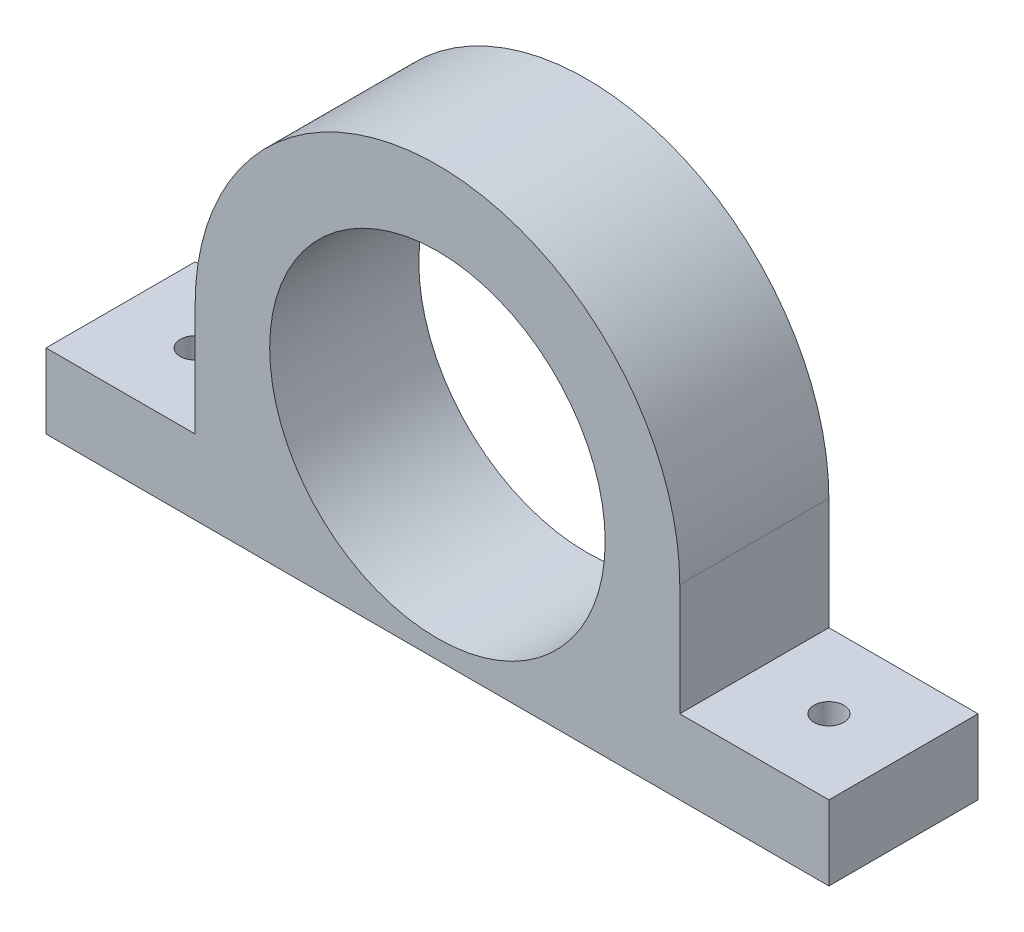
ISO-10303-21;
HEADER;
FILE_DESCRIPTION(('STEP AP214'),'2;1');
FILE_NAME('part.step','',(''),(''),'','','');
FILE_SCHEMA(('AUTOMOTIVE_DESIGN { 1 0 10303 214 1 1 1 1 }'));
ENDSEC;
DATA;
#1=APPLICATION_CONTEXT('core data for automotive mechanical design processes');
#2=APPLICATION_PROTOCOL_DEFINITION('international standard','automotive_design',2000,#1);
#3=PRODUCT_CONTEXT('',#1,'mechanical');
#4=PRODUCT('Part','Part','',(#3));
#5=PRODUCT_RELATED_PRODUCT_CATEGORY('part','',(#4));
#6=PRODUCT_DEFINITION_FORMATION('','',#4);
#7=PRODUCT_DEFINITION_CONTEXT('part definition',#1,'design');
#8=PRODUCT_DEFINITION('design','',#6,#7);
#9=PRODUCT_DEFINITION_SHAPE('','',#8);
#10=(LENGTH_UNIT() NAMED_UNIT(*) SI_UNIT(.MILLI.,.METRE.));
#11=(NAMED_UNIT(*) PLANE_ANGLE_UNIT() SI_UNIT($,.RADIAN.));
#12=(NAMED_UNIT(*) SI_UNIT($,.STERADIAN.) SOLID_ANGLE_UNIT());
#13=UNCERTAINTY_MEASURE_WITH_UNIT(LENGTH_MEASURE(1.E-05),#10,'distance_accuracy_value','');
#14=(GEOMETRIC_REPRESENTATION_CONTEXT(3) GLOBAL_UNCERTAINTY_ASSIGNED_CONTEXT((#13)) GLOBAL_UNIT_ASSIGNED_CONTEXT((#10,
#11,#12)) REPRESENTATION_CONTEXT('',''));
#15=CARTESIAN_POINT('',(0.,0.,0.));
#16=DIRECTION('',(0.,0.,1.));
#17=DIRECTION('',(1.,0.,0.));
#18=AXIS2_PLACEMENT_3D('',#15,#16,#17);
#19=CARTESIAN_POINT('',(-52.5,-25.,-187.499999999998));
#20=DIRECTION('',(0.,-1.,0.));
#21=DIRECTION('',(0.,0.,-1.));
#22=AXIS2_PLACEMENT_3D('',#19,#20,#21);
#23=PLANE('',#22);
#24=CARTESIAN_POINT('',(42.5,-25.,-177.499999999998));
#25=DIRECTION('',(0.,1.,0.));
#26=DIRECTION('',(0.,0.,1.));
#27=AXIS2_PLACEMENT_3D('',#24,#25,#26);
#28=CIRCLE('',#27,1.99999999999999);
#29=CARTESIAN_POINT('',(42.5,-25.,-175.499999999998));
#30=VERTEX_POINT('',#29);
#31=EDGE_CURVE('E217',#30,#30,#28,.T.);
#32=ORIENTED_EDGE('',*,*,#31,.T.);
#33=EDGE_LOOP('',(#32));
#34=FACE_BOUND('',#33,.T.);
#35=DIRECTION('',(1.,0.,0.));
#36=VECTOR('',#35,1.);
#37=CARTESIAN_POINT('',(-52.5,-25.,-167.499999999998));
#38=LINE('',#37,#36);
#39=CARTESIAN_POINT('',(-52.5,-25.,-167.499999999998));
#40=VERTEX_POINT('',#39);
#41=CARTESIAN_POINT('',(52.5,-25.,-167.499999999998));
#42=VERTEX_POINT('',#41);
#43=EDGE_CURVE('E144',#40,#42,#38,.T.);
#44=ORIENTED_EDGE('',*,*,#43,.F.);
#45=DIRECTION('',(0.,0.,1.));
#46=VECTOR('',#45,1.);
#47=CARTESIAN_POINT('',(-52.5,-25.,-187.499999999998));
#48=LINE('',#47,#46);
#49=CARTESIAN_POINT('',(-52.5,-25.,-187.499999999998));
#50=VERTEX_POINT('',#49);
#51=EDGE_CURVE('E156',#50,#40,#48,.T.);
#52=ORIENTED_EDGE('',*,*,#51,.F.);
#53=DIRECTION('',(1.,0.,0.));
#54=VECTOR('',#53,1.);
#55=CARTESIAN_POINT('',(-52.5,-25.,-187.499999999998));
#56=LINE('',#55,#54);
#57=CARTESIAN_POINT('',(52.5,-25.,-187.499999999998));
#58=VERTEX_POINT('',#57);
#59=EDGE_CURVE('E124',#50,#58,#56,.T.);
#60=ORIENTED_EDGE('',*,*,#59,.T.);
#61=DIRECTION('',(0.,0.,1.));
#62=VECTOR('',#61,1.);
#63=CARTESIAN_POINT('',(52.5,-25.,-187.499999999998));
#64=LINE('',#63,#62);
#65=EDGE_CURVE('E113',#58,#42,#64,.T.);
#66=ORIENTED_EDGE('',*,*,#65,.T.);
#67=EDGE_LOOP('',(#44,#52,#60,#66));
#68=FACE_BOUND('',#67,.T.);
#69=CARTESIAN_POINT('',(-42.5,-24.9999999999998,-177.499999999998));
#70=DIRECTION('',(0.,1.,0.));
#71=DIRECTION('',(0.,0.,1.));
#72=AXIS2_PLACEMENT_3D('',#69,#70,#71);
#73=CIRCLE('',#72,1.99999999999999);
#74=CARTESIAN_POINT('',(-42.5,-24.9999999999998,-175.499999999998));
#75=VERTEX_POINT('',#74);
#76=EDGE_CURVE('E227',#75,#75,#73,.T.);
#77=ORIENTED_EDGE('',*,*,#76,.T.);
#78=EDGE_LOOP('',(#77));
#79=FACE_BOUND('',#78,.T.);
#80=ADVANCED_FACE('F33',(#34,#68,#79),#23,.T.);
#81=CARTESIAN_POINT('',(0.,0.,-187.499999999998));
#82=DIRECTION('',(0.,0.,1.));
#83=DIRECTION('',(1.,0.,0.));
#84=AXIS2_PLACEMENT_3D('',#81,#82,#83);
#85=CYLINDRICAL_SURFACE('',#84,32.5);
#86=CARTESIAN_POINT('',(0.,0.,-167.499999999998));
#87=DIRECTION('',(0.,0.,1.));
#88=DIRECTION('',(-1.,0.,0.));
#89=AXIS2_PLACEMENT_3D('',#86,#87,#88);
#90=CIRCLE('',#89,32.5);
#91=CARTESIAN_POINT('',(32.5,0.,-167.499999999998));
#92=VERTEX_POINT('',#91);
#93=CARTESIAN_POINT('',(-32.5,0.,-167.499999999998));
#94=VERTEX_POINT('',#93);
#95=EDGE_CURVE('E131',#92,#94,#90,.T.);
#96=ORIENTED_EDGE('',*,*,#95,.F.);
#97=DIRECTION('',(0.,0.,1.));
#98=VECTOR('',#97,1.);
#99=CARTESIAN_POINT('',(32.5,0.,-187.499999999998));
#100=LINE('',#99,#98);
#101=CARTESIAN_POINT('',(32.5,0.,-187.499999999998));
#102=VERTEX_POINT('',#101);
#103=EDGE_CURVE('E11',#102,#92,#100,.T.);
#104=ORIENTED_EDGE('',*,*,#103,.F.);
#105=CARTESIAN_POINT('',(0.,0.,-187.499999999998));
#106=DIRECTION('',(0.,0.,1.));
#107=DIRECTION('',(-1.,0.,0.));
#108=AXIS2_PLACEMENT_3D('',#105,#106,#107);
#109=CIRCLE('',#108,32.5);
#110=CARTESIAN_POINT('',(-32.5,0.,-187.499999999998));
#111=VERTEX_POINT('',#110);
#112=EDGE_CURVE('E152',#102,#111,#109,.T.);
#113=ORIENTED_EDGE('',*,*,#112,.T.);
#114=DIRECTION('',(0.,0.,1.));
#115=VECTOR('',#114,1.);
#116=CARTESIAN_POINT('',(-32.5,0.,-187.499999999998));
#117=LINE('',#116,#115);
#118=EDGE_CURVE('E37',#111,#94,#117,.T.);
#119=ORIENTED_EDGE('',*,*,#118,.T.);
#120=EDGE_LOOP('',(#96,#104,#113,#119));
#121=FACE_BOUND('',#120,.T.);
#122=ADVANCED_FACE('F35',(#121),#85,.T.);
#123=CARTESIAN_POINT('',(32.5,-15.,-187.499999999998));
#124=DIRECTION('',(1.,0.,0.));
#125=DIRECTION('',(0.,0.,-1.));
#126=AXIS2_PLACEMENT_3D('',#123,#124,#125);
#127=PLANE('',#126);
#128=DIRECTION('',(0.,1.,0.));
#129=VECTOR('',#128,1.);
#130=CARTESIAN_POINT('',(32.5,-15.,-167.499999999998));
#131=LINE('',#130,#129);
#132=CARTESIAN_POINT('',(32.5,-15.,-167.499999999998));
#133=VERTEX_POINT('',#132);
#134=EDGE_CURVE('E150',#133,#92,#131,.T.);
#135=ORIENTED_EDGE('',*,*,#134,.F.);
#136=DIRECTION('',(0.,0.,1.));
#137=VECTOR('',#136,1.);
#138=CARTESIAN_POINT('',(32.5,-15.,-187.499999999998));
#139=LINE('',#138,#137);
#140=CARTESIAN_POINT('',(32.5,-15.,-187.499999999998));
#141=VERTEX_POINT('',#140);
#142=EDGE_CURVE('E43',#141,#133,#139,.T.);
#143=ORIENTED_EDGE('',*,*,#142,.F.);
#144=DIRECTION('',(0.,1.,0.));
#145=VECTOR('',#144,1.);
#146=CARTESIAN_POINT('',(32.5,-15.,-187.499999999998));
#147=LINE('',#146,#145);
#148=EDGE_CURVE('E121',#141,#102,#147,.T.);
#149=ORIENTED_EDGE('',*,*,#148,.T.);
#150=ORIENTED_EDGE('',*,*,#103,.T.);
#151=EDGE_LOOP('',(#135,#143,#149,#150));
#152=FACE_BOUND('',#151,.T.);
#153=ADVANCED_FACE('F164',(#152),#127,.T.);
#154=CARTESIAN_POINT('',(52.5,-15.,-187.499999999998));
#155=DIRECTION('',(0.,1.,0.));
#156=DIRECTION('',(-1.,0.,0.));
#157=AXIS2_PLACEMENT_3D('',#154,#155,#156);
#158=PLANE('',#157);
#159=CARTESIAN_POINT('',(42.5,-15.,-177.499999999998));
#160=DIRECTION('',(0.,1.,0.));
#161=DIRECTION('',(0.,0.,1.));
#162=AXIS2_PLACEMENT_3D('',#159,#160,#161);
#163=CIRCLE('',#162,1.99999999999999);
#164=CARTESIAN_POINT('',(42.5,-15.,-175.499999999998));
#165=VERTEX_POINT('',#164);
#166=EDGE_CURVE('E220',#165,#165,#163,.T.);
#167=ORIENTED_EDGE('',*,*,#166,.F.);
#168=EDGE_LOOP('',(#167));
#169=FACE_BOUND('',#168,.T.);
#170=DIRECTION('',(-1.,0.,0.));
#171=VECTOR('',#170,1.);
#172=CARTESIAN_POINT('',(52.5,-15.,-167.499999999998));
#173=LINE('',#172,#171);
#174=CARTESIAN_POINT('',(52.5,-15.,-167.499999999998));
#175=VERTEX_POINT('',#174);
#176=EDGE_CURVE('E108',#175,#133,#173,.T.);
#177=ORIENTED_EDGE('',*,*,#176,.F.);
#178=DIRECTION('',(0.,0.,1.));
#179=VECTOR('',#178,1.);
#180=CARTESIAN_POINT('',(52.5,-15.,-187.499999999998));
#181=LINE('',#180,#179);
#182=CARTESIAN_POINT('',(52.5,-15.,-187.499999999998));
#183=VERTEX_POINT('',#182);
#184=EDGE_CURVE('E103',#183,#175,#181,.T.);
#185=ORIENTED_EDGE('',*,*,#184,.F.);
#186=DIRECTION('',(-1.,0.,0.));
#187=VECTOR('',#186,1.);
#188=CARTESIAN_POINT('',(52.5,-15.,-187.499999999998));
#189=LINE('',#188,#187);
#190=EDGE_CURVE('E106',#183,#141,#189,.T.);
#191=ORIENTED_EDGE('',*,*,#190,.T.);
#192=ORIENTED_EDGE('',*,*,#142,.T.);
#193=EDGE_LOOP('',(#177,#185,#191,#192));
#194=FACE_BOUND('',#193,.T.);
#195=ADVANCED_FACE('F105',(#169,#194),#158,.T.);
#196=CARTESIAN_POINT('',(52.5,-25.,-187.499999999998));
#197=DIRECTION('',(1.,0.,0.));
#198=DIRECTION('',(0.,0.,-1.));
#199=AXIS2_PLACEMENT_3D('',#196,#197,#198);
#200=PLANE('',#199);
#201=DIRECTION('',(0.,1.,0.));
#202=VECTOR('',#201,1.);
#203=CARTESIAN_POINT('',(52.5,-25.,-167.499999999998));
#204=LINE('',#203,#202);
#205=EDGE_CURVE('E147',#42,#175,#204,.T.);
#206=ORIENTED_EDGE('',*,*,#205,.F.);
#207=ORIENTED_EDGE('',*,*,#65,.F.);
#208=DIRECTION('',(0.,1.,0.));
#209=VECTOR('',#208,1.);
#210=CARTESIAN_POINT('',(52.5,-25.,-187.499999999998));
#211=LINE('',#210,#209);
#212=EDGE_CURVE('E119',#58,#183,#211,.T.);
#213=ORIENTED_EDGE('',*,*,#212,.T.);
#214=ORIENTED_EDGE('',*,*,#184,.T.);
#215=EDGE_LOOP('',(#206,#207,#213,#214));
#216=FACE_BOUND('',#215,.T.);
#217=ADVANCED_FACE('F123',(#216),#200,.T.);
#218=CARTESIAN_POINT('',(-52.5,-15.,-187.499999999998));
#219=DIRECTION('',(-1.,0.,0.));
#220=DIRECTION('',(0.,0.,1.));
#221=AXIS2_PLACEMENT_3D('',#218,#219,#220);
#222=PLANE('',#221);
#223=DIRECTION('',(0.,-1.,0.));
#224=VECTOR('',#223,1.);
#225=CARTESIAN_POINT('',(-52.5,-15.,-167.499999999998));
#226=LINE('',#225,#224);
#227=CARTESIAN_POINT('',(-52.5,-15.,-167.499999999998));
#228=VERTEX_POINT('',#227);
#229=EDGE_CURVE('E141',#228,#40,#226,.T.);
#230=ORIENTED_EDGE('',*,*,#229,.F.);
#231=DIRECTION('',(0.,0.,1.));
#232=VECTOR('',#231,1.);
#233=CARTESIAN_POINT('',(-52.5,-15.,-187.499999999998));
#234=LINE('',#233,#232);
#235=CARTESIAN_POINT('',(-52.5,-15.,-187.499999999998));
#236=VERTEX_POINT('',#235);
#237=EDGE_CURVE('E158',#236,#228,#234,.T.);
#238=ORIENTED_EDGE('',*,*,#237,.F.);
#239=DIRECTION('',(0.,-1.,0.));
#240=VECTOR('',#239,1.);
#241=CARTESIAN_POINT('',(-52.5,-15.,-187.499999999998));
#242=LINE('',#241,#240);
#243=EDGE_CURVE('E126',#236,#50,#242,.T.);
#244=ORIENTED_EDGE('',*,*,#243,.T.);
#245=ORIENTED_EDGE('',*,*,#51,.T.);
#246=EDGE_LOOP('',(#230,#238,#244,#245));
#247=FACE_BOUND('',#246,.T.);
#248=ADVANCED_FACE('F183',(#247),#222,.T.);
#249=CARTESIAN_POINT('',(-32.5,-15.,-187.499999999998));
#250=DIRECTION('',(0.,1.,0.));
#251=DIRECTION('',(-1.,0.,0.));
#252=AXIS2_PLACEMENT_3D('',#249,#250,#251);
#253=PLANE('',#252);
#254=CARTESIAN_POINT('',(-42.5,-14.9999999999999,-177.499999999998));
#255=DIRECTION('',(0.,1.,0.));
#256=DIRECTION('',(0.,0.,1.));
#257=AXIS2_PLACEMENT_3D('',#254,#255,#256);
#258=CIRCLE('',#257,1.99999999999999);
#259=CARTESIAN_POINT('',(-42.5,-14.9999999999999,-175.499999999998));
#260=VERTEX_POINT('',#259);
#261=EDGE_CURVE('E222',#260,#260,#258,.T.);
#262=ORIENTED_EDGE('',*,*,#261,.F.);
#263=EDGE_LOOP('',(#262));
#264=FACE_BOUND('',#263,.T.);
#265=DIRECTION('',(-1.,0.,0.));
#266=VECTOR('',#265,1.);
#267=CARTESIAN_POINT('',(-32.5,-15.,-167.499999999998));
#268=LINE('',#267,#266);
#269=CARTESIAN_POINT('',(-32.5,-15.,-167.499999999998));
#270=VERTEX_POINT('',#269);
#271=EDGE_CURVE('E138',#270,#228,#268,.T.);
#272=ORIENTED_EDGE('',*,*,#271,.F.);
#273=DIRECTION('',(0.,0.,1.));
#274=VECTOR('',#273,1.);
#275=CARTESIAN_POINT('',(-32.5,-15.,-187.499999999998));
#276=LINE('',#275,#274);
#277=CARTESIAN_POINT('',(-32.5,-15.,-187.499999999998));
#278=VERTEX_POINT('',#277);
#279=EDGE_CURVE('E159',#278,#270,#276,.T.);
#280=ORIENTED_EDGE('',*,*,#279,.F.);
#281=DIRECTION('',(-1.,0.,0.));
#282=VECTOR('',#281,1.);
#283=CARTESIAN_POINT('',(-32.5,-15.,-187.499999999998));
#284=LINE('',#283,#282);
#285=EDGE_CURVE('E237',#278,#236,#284,.T.);
#286=ORIENTED_EDGE('',*,*,#285,.T.);
#287=ORIENTED_EDGE('',*,*,#237,.T.);
#288=EDGE_LOOP('',(#272,#280,#286,#287));
#289=FACE_BOUND('',#288,.T.);
#290=ADVANCED_FACE('F186',(#264,#289),#253,.T.);
#291=CARTESIAN_POINT('',(-32.5,0.,-187.499999999998));
#292=DIRECTION('',(-1.,0.,0.));
#293=DIRECTION('',(0.,0.,1.));
#294=AXIS2_PLACEMENT_3D('',#291,#292,#293);
#295=PLANE('',#294);
#296=DIRECTION('',(0.,-1.,0.));
#297=VECTOR('',#296,1.);
#298=CARTESIAN_POINT('',(-32.5,0.,-167.499999999998));
#299=LINE('',#298,#297);
#300=EDGE_CURVE('E134',#94,#270,#299,.T.);
#301=ORIENTED_EDGE('',*,*,#300,.F.);
#302=ORIENTED_EDGE('',*,*,#118,.F.);
#303=DIRECTION('',(0.,-1.,0.));
#304=VECTOR('',#303,1.);
#305=CARTESIAN_POINT('',(-32.5,0.,-187.499999999998));
#306=LINE('',#305,#304);
#307=EDGE_CURVE('E235',#111,#278,#306,.T.);
#308=ORIENTED_EDGE('',*,*,#307,.T.);
#309=ORIENTED_EDGE('',*,*,#279,.T.);
#310=EDGE_LOOP('',(#301,#302,#308,#309));
#311=FACE_BOUND('',#310,.T.);
#312=ADVANCED_FACE('F161',(#311),#295,.T.);
#313=CARTESIAN_POINT('',(0.,0.,-187.499999999998));
#314=DIRECTION('',(0.,0.,-1.));
#315=DIRECTION('',(-1.,0.,0.));
#316=AXIS2_PLACEMENT_3D('',#313,#314,#315);
#317=PLANE('',#316);
#318=CARTESIAN_POINT('',(0.,0.,-187.499999999998));
#319=DIRECTION('',(0.,0.,1.));
#320=DIRECTION('',(1.,0.,0.));
#321=AXIS2_PLACEMENT_3D('',#318,#319,#320);
#322=CIRCLE('',#321,22.5);
#323=CARTESIAN_POINT('',(22.5,0.,-187.499999999998));
#324=VERTEX_POINT('',#323);
#325=EDGE_CURVE('E135',#324,#324,#322,.T.);
#326=ORIENTED_EDGE('',*,*,#325,.T.);
#327=EDGE_LOOP('',(#326));
#328=FACE_BOUND('',#327,.T.);
#329=ORIENTED_EDGE('',*,*,#112,.F.);
#330=ORIENTED_EDGE('',*,*,#148,.F.);
#331=ORIENTED_EDGE('',*,*,#190,.F.);
#332=ORIENTED_EDGE('',*,*,#212,.F.);
#333=ORIENTED_EDGE('',*,*,#59,.F.);
#334=ORIENTED_EDGE('',*,*,#243,.F.);
#335=ORIENTED_EDGE('',*,*,#285,.F.);
#336=ORIENTED_EDGE('',*,*,#307,.F.);
#337=EDGE_LOOP('',(#329,#330,#331,#332,#333,#334,#335,#336));
#338=FACE_BOUND('',#337,.T.);
#339=ADVANCED_FACE('F117',(#328,#338),#317,.T.);
#340=CARTESIAN_POINT('',(0.,0.,-167.499999999998));
#341=DIRECTION('',(0.,0.,-1.));
#342=DIRECTION('',(-1.,0.,0.));
#343=AXIS2_PLACEMENT_3D('',#340,#341,#342);
#344=PLANE('',#343);
#345=CARTESIAN_POINT('',(0.,0.,-167.499999999998));
#346=DIRECTION('',(0.,0.,1.));
#347=DIRECTION('',(1.,0.,0.));
#348=AXIS2_PLACEMENT_3D('',#345,#346,#347);
#349=CIRCLE('',#348,22.5);
#350=CARTESIAN_POINT('',(22.5,0.,-167.499999999998));
#351=VERTEX_POINT('',#350);
#352=EDGE_CURVE('E230',#351,#351,#349,.T.);
#353=ORIENTED_EDGE('',*,*,#352,.F.);
#354=EDGE_LOOP('',(#353));
#355=FACE_BOUND('',#354,.T.);
#356=ORIENTED_EDGE('',*,*,#95,.T.);
#357=ORIENTED_EDGE('',*,*,#300,.T.);
#358=ORIENTED_EDGE('',*,*,#271,.T.);
#359=ORIENTED_EDGE('',*,*,#229,.T.);
#360=ORIENTED_EDGE('',*,*,#43,.T.);
#361=ORIENTED_EDGE('',*,*,#205,.T.);
#362=ORIENTED_EDGE('',*,*,#176,.T.);
#363=ORIENTED_EDGE('',*,*,#134,.T.);
#364=EDGE_LOOP('',(#356,#357,#358,#359,#360,#361,#362,#363));
#365=FACE_BOUND('',#364,.T.);
#366=ADVANCED_FACE('F163',(#355,#365),#344,.F.);
#367=CARTESIAN_POINT('',(0.,0.,-187.499999999998));
#368=DIRECTION('',(0.,0.,1.));
#369=DIRECTION('',(1.,0.,0.));
#370=AXIS2_PLACEMENT_3D('',#367,#368,#369);
#371=CYLINDRICAL_SURFACE('',#370,22.5);
#372=ORIENTED_EDGE('',*,*,#325,.F.);
#373=EDGE_LOOP('',(#372));
#374=FACE_BOUND('',#373,.T.);
#375=ORIENTED_EDGE('',*,*,#352,.T.);
#376=EDGE_LOOP('',(#375));
#377=FACE_BOUND('',#376,.T.);
#378=ADVANCED_FACE('F199',(#374,#377),#371,.F.);
#379=CARTESIAN_POINT('',(-42.5,-14.9999999999999,-177.499999999998));
#380=DIRECTION('',(0.,1.,0.));
#381=DIRECTION('',(0.,0.,1.));
#382=AXIS2_PLACEMENT_3D('',#379,#380,#381);
#383=CYLINDRICAL_SURFACE('',#382,1.99999999999999);
#384=ORIENTED_EDGE('',*,*,#76,.F.);
#385=EDGE_LOOP('',(#384));
#386=FACE_BOUND('',#385,.T.);
#387=ORIENTED_EDGE('',*,*,#261,.T.);
#388=EDGE_LOOP('',(#387));
#389=FACE_BOUND('',#388,.T.);
#390=ADVANCED_FACE('F205',(#386,#389),#383,.F.);
#391=CARTESIAN_POINT('',(42.5,-15.,-177.499999999998));
#392=DIRECTION('',(0.,1.,0.));
#393=DIRECTION('',(0.,0.,1.));
#394=AXIS2_PLACEMENT_3D('',#391,#392,#393);
#395=CYLINDRICAL_SURFACE('',#394,1.99999999999999);
#396=ORIENTED_EDGE('',*,*,#31,.F.);
#397=EDGE_LOOP('',(#396));
#398=FACE_BOUND('',#397,.T.);
#399=ORIENTED_EDGE('',*,*,#166,.T.);
#400=EDGE_LOOP('',(#399));
#401=FACE_BOUND('',#400,.T.);
#402=ADVANCED_FACE('F209',(#398,#401),#395,.F.);
#403=CLOSED_SHELL('',(#80,#122,#153,#195,#217,#248,#290,#312,#339,#366,#378,#390,#402));
#404=MANIFOLD_SOLID_BREP('B2',#403);
#405=ADVANCED_BREP_SHAPE_REPRESENTATION('',(#18,#404),#14);
#406=SHAPE_DEFINITION_REPRESENTATION(#9,#405);
ENDSEC;
END-ISO-10303-21;
